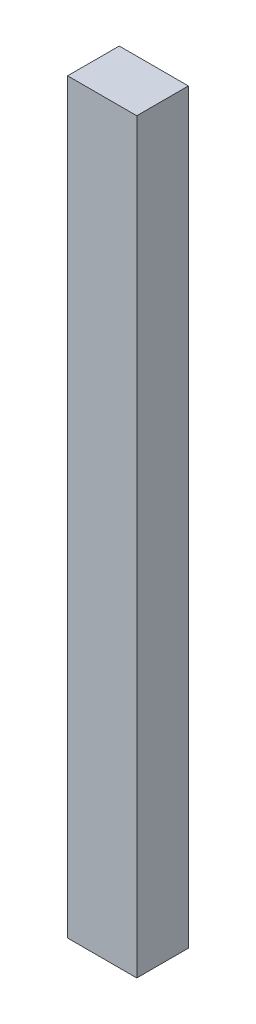
ISO-10303-21;
HEADER;
FILE_DESCRIPTION(('STEP AP214'),'2;1');
FILE_NAME('part.step','',(''),(''),'','','');
FILE_SCHEMA(('AUTOMOTIVE_DESIGN { 1 0 10303 214 1 1 1 1 }'));
ENDSEC;
DATA;
#1=APPLICATION_CONTEXT('core data for automotive mechanical design processes');
#2=APPLICATION_PROTOCOL_DEFINITION('international standard','automotive_design',2000,#1);
#3=PRODUCT_CONTEXT('',#1,'mechanical');
#4=PRODUCT('Part','Part','',(#3));
#5=PRODUCT_RELATED_PRODUCT_CATEGORY('part','',(#4));
#6=PRODUCT_DEFINITION_FORMATION('','',#4);
#7=PRODUCT_DEFINITION_CONTEXT('part definition',#1,'design');
#8=PRODUCT_DEFINITION('design','',#6,#7);
#9=PRODUCT_DEFINITION_SHAPE('','',#8);
#10=(LENGTH_UNIT() NAMED_UNIT(*) SI_UNIT(.MILLI.,.METRE.));
#11=(NAMED_UNIT(*) PLANE_ANGLE_UNIT() SI_UNIT($,.RADIAN.));
#12=(NAMED_UNIT(*) SI_UNIT($,.STERADIAN.) SOLID_ANGLE_UNIT());
#13=UNCERTAINTY_MEASURE_WITH_UNIT(LENGTH_MEASURE(1.E-05),#10,'distance_accuracy_value','');
#14=(GEOMETRIC_REPRESENTATION_CONTEXT(3) GLOBAL_UNCERTAINTY_ASSIGNED_CONTEXT((#13)) GLOBAL_UNIT_ASSIGNED_CONTEXT((#10,
#11,#12)) REPRESENTATION_CONTEXT('',''));
#15=CARTESIAN_POINT('',(0.,0.,0.));
#16=DIRECTION('',(0.,0.,1.));
#17=DIRECTION('',(1.,0.,0.));
#18=AXIS2_PLACEMENT_3D('',#15,#16,#17);
#19=CARTESIAN_POINT('',(-27.8320890870254,635.,24.5000784216773));
#20=DIRECTION('',(1.,0.,0.));
#21=DIRECTION('',(0.,0.,-1.));
#22=AXIS2_PLACEMENT_3D('',#19,#20,#21);
#23=PLANE('',#22);
#24=DIRECTION('',(0.,0.,1.));
#25=VECTOR('',#24,1.);
#26=CARTESIAN_POINT('',(-27.8320890870254,0.,24.5000784216773));
#27=LINE('',#26,#25);
#28=CARTESIAN_POINT('',(-27.8320890870254,0.,-19.4040621099685));
#29=VERTEX_POINT('',#28);
#30=CARTESIAN_POINT('',(-27.8320890870254,0.,24.5000784216773));
#31=VERTEX_POINT('',#30);
#32=EDGE_CURVE('E96',#29,#31,#27,.T.);
#33=ORIENTED_EDGE('',*,*,#32,.T.);
#34=DIRECTION('',(0.,-1.,0.));
#35=VECTOR('',#34,1.);
#36=CARTESIAN_POINT('',(-27.8320890870254,635.,24.5000784216773));
#37=LINE('',#36,#35);
#38=CARTESIAN_POINT('',(-27.8320890870254,635.,24.5000784216773));
#39=VERTEX_POINT('',#38);
#40=EDGE_CURVE('E11',#39,#31,#37,.T.);
#41=ORIENTED_EDGE('',*,*,#40,.F.);
#42=DIRECTION('',(0.,0.,1.));
#43=VECTOR('',#42,1.);
#44=CARTESIAN_POINT('',(-27.8320890870254,635.,24.5000784216773));
#45=LINE('',#44,#43);
#46=CARTESIAN_POINT('',(-27.8320890870254,635.,-19.4040621099685));
#47=VERTEX_POINT('',#46);
#48=EDGE_CURVE('E84',#47,#39,#45,.T.);
#49=ORIENTED_EDGE('',*,*,#48,.F.);
#50=DIRECTION('',(0.,-1.,0.));
#51=VECTOR('',#50,1.);
#52=CARTESIAN_POINT('',(-27.8320890870254,635.,-19.4040621099685));
#53=LINE('',#52,#51);
#54=EDGE_CURVE('E92',#47,#29,#53,.T.);
#55=ORIENTED_EDGE('',*,*,#54,.T.);
#56=EDGE_LOOP('',(#33,#41,#49,#55));
#57=FACE_BOUND('',#56,.T.);
#58=ADVANCED_FACE('F33',(#57),#23,.F.);
#59=CARTESIAN_POINT('',(30.9680991250002,635.,24.5000784216773));
#60=DIRECTION('',(0.,0.,-1.));
#61=DIRECTION('',(-1.,0.,0.));
#62=AXIS2_PLACEMENT_3D('',#59,#60,#61);
#63=PLANE('',#62);
#64=DIRECTION('',(1.,0.,0.));
#65=VECTOR('',#64,1.);
#66=CARTESIAN_POINT('',(30.9680991250002,0.,24.5000784216773));
#67=LINE('',#66,#65);
#68=CARTESIAN_POINT('',(30.9680991250002,0.,24.5000784216773));
#69=VERTEX_POINT('',#68);
#70=EDGE_CURVE('E88',#31,#69,#67,.T.);
#71=ORIENTED_EDGE('',*,*,#70,.T.);
#72=DIRECTION('',(0.,-1.,0.));
#73=VECTOR('',#72,1.);
#74=CARTESIAN_POINT('',(30.9680991250002,635.,24.5000784216773));
#75=LINE('',#74,#73);
#76=CARTESIAN_POINT('',(30.9680991250002,635.,24.5000784216773));
#77=VERTEX_POINT('',#76);
#78=EDGE_CURVE('E41',#77,#69,#75,.T.);
#79=ORIENTED_EDGE('',*,*,#78,.F.);
#80=DIRECTION('',(1.,0.,0.));
#81=VECTOR('',#80,1.);
#82=CARTESIAN_POINT('',(30.9680991250002,635.,24.5000784216773));
#83=LINE('',#82,#81);
#84=EDGE_CURVE('E79',#39,#77,#83,.T.);
#85=ORIENTED_EDGE('',*,*,#84,.F.);
#86=ORIENTED_EDGE('',*,*,#40,.T.);
#87=EDGE_LOOP('',(#71,#79,#85,#86));
#88=FACE_BOUND('',#87,.T.);
#89=ADVANCED_FACE('F87',(#88),#63,.F.);
#90=CARTESIAN_POINT('',(30.9680991250002,635.,-19.4040621099685));
#91=DIRECTION('',(-1.,0.,0.));
#92=DIRECTION('',(0.,0.,1.));
#93=AXIS2_PLACEMENT_3D('',#90,#91,#92);
#94=PLANE('',#93);
#95=DIRECTION('',(0.,0.,-1.));
#96=VECTOR('',#95,1.);
#97=CARTESIAN_POINT('',(30.9680991250002,0.,-19.4040621099685));
#98=LINE('',#97,#96);
#99=CARTESIAN_POINT('',(30.9680991250002,0.,-19.4040621099685));
#100=VERTEX_POINT('',#99);
#101=EDGE_CURVE('E66',#69,#100,#98,.T.);
#102=ORIENTED_EDGE('',*,*,#101,.T.);
#103=DIRECTION('',(0.,-1.,0.));
#104=VECTOR('',#103,1.);
#105=CARTESIAN_POINT('',(30.9680991250002,635.,-19.4040621099685));
#106=LINE('',#105,#104);
#107=CARTESIAN_POINT('',(30.9680991250002,635.,-19.4040621099685));
#108=VERTEX_POINT('',#107);
#109=EDGE_CURVE('E89',#108,#100,#106,.T.);
#110=ORIENTED_EDGE('',*,*,#109,.F.);
#111=DIRECTION('',(0.,0.,-1.));
#112=VECTOR('',#111,1.);
#113=CARTESIAN_POINT('',(30.9680991250002,635.,-19.4040621099685));
#114=LINE('',#113,#112);
#115=EDGE_CURVE('E82',#77,#108,#114,.T.);
#116=ORIENTED_EDGE('',*,*,#115,.F.);
#117=ORIENTED_EDGE('',*,*,#78,.T.);
#118=EDGE_LOOP('',(#102,#110,#116,#117));
#119=FACE_BOUND('',#118,.T.);
#120=ADVANCED_FACE('F90',(#119),#94,.F.);
#121=CARTESIAN_POINT('',(-27.8320890870254,635.,-19.4040621099685));
#122=DIRECTION('',(0.,0.,1.));
#123=DIRECTION('',(1.,0.,0.));
#124=AXIS2_PLACEMENT_3D('',#121,#122,#123);
#125=PLANE('',#124);
#126=DIRECTION('',(-1.,0.,0.));
#127=VECTOR('',#126,1.);
#128=CARTESIAN_POINT('',(-27.8320890870254,0.,-19.4040621099685));
#129=LINE('',#128,#127);
#130=EDGE_CURVE('E72',#100,#29,#129,.T.);
#131=ORIENTED_EDGE('',*,*,#130,.T.);
#132=ORIENTED_EDGE('',*,*,#54,.F.);
#133=DIRECTION('',(-1.,0.,0.));
#134=VECTOR('',#133,1.);
#135=CARTESIAN_POINT('',(-27.8320890870254,635.,-19.4040621099685));
#136=LINE('',#135,#134);
#137=EDGE_CURVE('E49',#108,#47,#136,.T.);
#138=ORIENTED_EDGE('',*,*,#137,.F.);
#139=ORIENTED_EDGE('',*,*,#109,.T.);
#140=EDGE_LOOP('',(#131,#132,#138,#139));
#141=FACE_BOUND('',#140,.T.);
#142=ADVANCED_FACE('F103',(#141),#125,.F.);
#143=CARTESIAN_POINT('',(0.,635.,0.));
#144=DIRECTION('',(0.,-1.,0.));
#145=DIRECTION('',(0.,0.,-1.));
#146=AXIS2_PLACEMENT_3D('',#143,#144,#145);
#147=PLANE('',#146);
#148=ORIENTED_EDGE('',*,*,#48,.T.);
#149=ORIENTED_EDGE('',*,*,#84,.T.);
#150=ORIENTED_EDGE('',*,*,#115,.T.);
#151=ORIENTED_EDGE('',*,*,#137,.T.);
#152=EDGE_LOOP('',(#148,#149,#150,#151));
#153=FACE_BOUND('',#152,.T.);
#154=ADVANCED_FACE('F80',(#153),#147,.F.);
#155=CARTESIAN_POINT('',(0.,0.,0.));
#156=DIRECTION('',(0.,-1.,0.));
#157=DIRECTION('',(0.,0.,-1.));
#158=AXIS2_PLACEMENT_3D('',#155,#156,#157);
#159=PLANE('',#158);
#160=ORIENTED_EDGE('',*,*,#32,.F.);
#161=ORIENTED_EDGE('',*,*,#130,.F.);
#162=ORIENTED_EDGE('',*,*,#101,.F.);
#163=ORIENTED_EDGE('',*,*,#70,.F.);
#164=EDGE_LOOP('',(#160,#161,#162,#163));
#165=FACE_BOUND('',#164,.T.);
#166=ADVANCED_FACE('F106',(#165),#159,.T.);
#167=CLOSED_SHELL('',(#58,#89,#120,#142,#154,#166));
#168=MANIFOLD_SOLID_BREP('B2',#167);
#169=ADVANCED_BREP_SHAPE_REPRESENTATION('',(#18,#168),#14);
#170=SHAPE_DEFINITION_REPRESENTATION(#9,#169);
ENDSEC;
END-ISO-10303-21;
